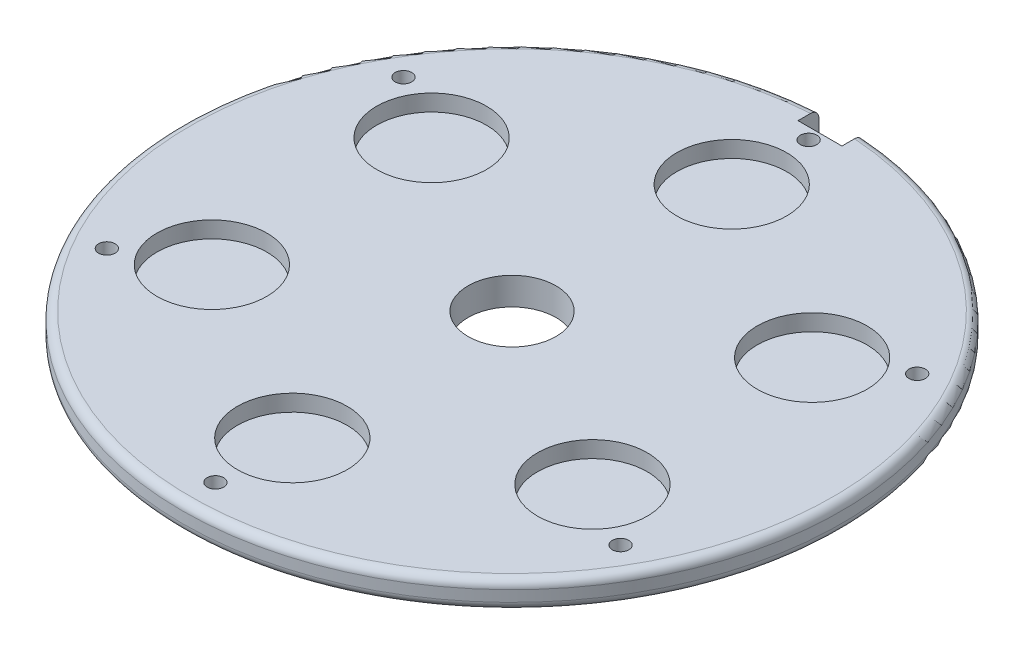
ISO-10303-21;
HEADER;
FILE_DESCRIPTION(('STEP AP214'),'2;1');
FILE_NAME('part.step','',(''),(''),'','','');
FILE_SCHEMA(('AUTOMOTIVE_DESIGN { 1 0 10303 214 1 1 1 1 }'));
ENDSEC;
DATA;
#1=APPLICATION_CONTEXT('core data for automotive mechanical design processes');
#2=APPLICATION_PROTOCOL_DEFINITION('international standard','automotive_design',2000,#1);
#3=PRODUCT_CONTEXT('',#1,'mechanical');
#4=PRODUCT('Part','Part','',(#3));
#5=PRODUCT_RELATED_PRODUCT_CATEGORY('part','',(#4));
#6=PRODUCT_DEFINITION_FORMATION('','',#4);
#7=PRODUCT_DEFINITION_CONTEXT('part definition',#1,'design');
#8=PRODUCT_DEFINITION('design','',#6,#7);
#9=PRODUCT_DEFINITION_SHAPE('','',#8);
#10=(LENGTH_UNIT() NAMED_UNIT(*) SI_UNIT(.MILLI.,.METRE.));
#11=(NAMED_UNIT(*) PLANE_ANGLE_UNIT() SI_UNIT($,.RADIAN.));
#12=(NAMED_UNIT(*) SI_UNIT($,.STERADIAN.) SOLID_ANGLE_UNIT());
#13=UNCERTAINTY_MEASURE_WITH_UNIT(LENGTH_MEASURE(1.E-05),#10,'distance_accuracy_value','');
#14=(GEOMETRIC_REPRESENTATION_CONTEXT(3) GLOBAL_UNCERTAINTY_ASSIGNED_CONTEXT((#13)) GLOBAL_UNIT_ASSIGNED_CONTEXT((#10,
#11,#12)) REPRESENTATION_CONTEXT('',''));
#15=CARTESIAN_POINT('',(0.,0.,0.));
#16=DIRECTION('',(0.,0.,1.));
#17=DIRECTION('',(1.,0.,0.));
#18=AXIS2_PLACEMENT_3D('',#15,#16,#17);
#19=CARTESIAN_POINT('',(0.,5.,0.));
#20=DIRECTION('',(0.,-1.,0.));
#21=DIRECTION('',(0.,0.,-1.));
#22=AXIS2_PLACEMENT_3D('',#19,#20,#21);
#23=CYLINDRICAL_SURFACE('',#22,59.9999999999999);
#24=DIRECTION('',(0.,-1.,0.));
#25=VECTOR('',#24,1.);
#26=CARTESIAN_POINT('',(-4.,5.,-59.866518188383));
#27=LINE('',#26,#25);
#28=CARTESIAN_POINT('',(-4.,3.5,-59.866518188383));
#29=VERTEX_POINT('',#28);
#30=CARTESIAN_POINT('',(-4.,1.5,-59.866518188383));
#31=VERTEX_POINT('',#30);
#32=EDGE_CURVE('E107',#29,#31,#27,.T.);
#33=ORIENTED_EDGE('',*,*,#32,.T.);
#34=CARTESIAN_POINT('',(0.,1.5,0.));
#35=DIRECTION('',(0.,1.,0.));
#36=DIRECTION('',(0.,0.,1.));
#37=AXIS2_PLACEMENT_3D('',#34,#35,#36);
#38=CIRCLE('',#37,59.9999999999999);
#39=CARTESIAN_POINT('',(4.,1.5,-59.866518188383));
#40=VERTEX_POINT('',#39);
#41=EDGE_CURVE('E211',#31,#40,#38,.T.);
#42=ORIENTED_EDGE('',*,*,#41,.T.);
#43=DIRECTION('',(0.,-1.,0.));
#44=VECTOR('',#43,1.);
#45=CARTESIAN_POINT('',(4.,5.,-59.866518188383));
#46=LINE('',#45,#44);
#47=CARTESIAN_POINT('',(4.,3.5,-59.866518188383));
#48=VERTEX_POINT('',#47);
#49=EDGE_CURVE('E127',#40,#48,#46,.F.);
#50=ORIENTED_EDGE('',*,*,#49,.T.);
#51=CARTESIAN_POINT('',(0.,3.5,0.));
#52=DIRECTION('',(0.,1.,0.));
#53=DIRECTION('',(0.,0.,1.));
#54=AXIS2_PLACEMENT_3D('',#51,#52,#53);
#55=CIRCLE('',#54,59.9999999999999);
#56=EDGE_CURVE('E209',#48,#29,#55,.F.);
#57=ORIENTED_EDGE('',*,*,#56,.T.);
#58=EDGE_LOOP('',(#33,#42,#50,#57));
#59=FACE_BOUND('',#58,.T.);
#60=ADVANCED_FACE('F39',(#59),#23,.T.);
#61=CARTESIAN_POINT('',(0.,5.,0.));
#62=DIRECTION('',(0.,1.,0.));
#63=DIRECTION('',(0.,0.,1.));
#64=AXIS2_PLACEMENT_3D('',#61,#62,#63);
#65=PLANE('',#64);
#66=DIRECTION('',(0.,0.,1.));
#67=VECTOR('',#66,1.);
#68=CARTESIAN_POINT('',(-4.,5.,-60.0670028712571));
#69=LINE('',#68,#67);
#70=CARTESIAN_POINT('',(-4.,5.,-58.3630876496437));
#71=VERTEX_POINT('',#70);
#72=CARTESIAN_POINT('',(-4.,5.,-56.0670028712571));
#73=VERTEX_POINT('',#72);
#74=EDGE_CURVE('E122',#71,#73,#69,.T.);
#75=ORIENTED_EDGE('',*,*,#74,.F.);
#76=CARTESIAN_POINT('',(0.,5.,0.));
#77=DIRECTION('',(0.,1.,0.));
#78=DIRECTION('',(0.,0.,1.));
#79=AXIS2_PLACEMENT_3D('',#76,#77,#78);
#80=CIRCLE('',#79,58.4999999999999);
#81=CARTESIAN_POINT('',(4.,5.,-58.3630876496437));
#82=VERTEX_POINT('',#81);
#83=EDGE_CURVE('E11',#71,#82,#80,.T.);
#84=ORIENTED_EDGE('',*,*,#83,.T.);
#85=DIRECTION('',(0.,0.,-1.));
#86=VECTOR('',#85,1.);
#87=CARTESIAN_POINT('',(4.,5.,-60.0670028712571));
#88=LINE('',#87,#86);
#89=CARTESIAN_POINT('',(4.,5.,-56.0670028712571));
#90=VERTEX_POINT('',#89);
#91=EDGE_CURVE('E120',#90,#82,#88,.T.);
#92=ORIENTED_EDGE('',*,*,#91,.F.);
#93=DIRECTION('',(1.,0.,0.));
#94=VECTOR('',#93,1.);
#95=CARTESIAN_POINT('',(-4.,5.,-56.0670028712571));
#96=LINE('',#95,#94);
#97=EDGE_CURVE('E103',#73,#90,#96,.T.);
#98=ORIENTED_EDGE('',*,*,#97,.F.);
#99=EDGE_LOOP('',(#75,#84,#92,#98));
#100=FACE_BOUND('',#99,.T.);
#101=CARTESIAN_POINT('',(46.7653718043594,5.,-27.0000000000005));
#102=DIRECTION('',(0.,1.,0.));
#103=DIRECTION('',(-0.866025403784433,0.,0.50000000000001));
#104=AXIS2_PLACEMENT_3D('',#101,#102,#103);
#105=CIRCLE('',#104,1.5);
#106=CARTESIAN_POINT('',(45.4663336986827,5.,-26.2500000000005));
#107=VERTEX_POINT('',#106);
#108=EDGE_CURVE('E130',#107,#107,#105,.T.);
#109=ORIENTED_EDGE('',*,*,#108,.F.);
#110=EDGE_LOOP('',(#109));
#111=FACE_BOUND('',#110,.T.);
#112=CARTESIAN_POINT('',(46.7653718043599,5.,26.9999999999996));
#113=DIRECTION('',(0.,1.,0.));
#114=DIRECTION('',(-0.866025403784443,0.,-0.499999999999992));
#115=AXIS2_PLACEMENT_3D('',#112,#113,#114);
#116=CIRCLE('',#115,1.5);
#117=CARTESIAN_POINT('',(45.4663336986833,5.,26.2499999999996));
#118=VERTEX_POINT('',#117);
#119=EDGE_CURVE('E147',#118,#118,#116,.T.);
#120=ORIENTED_EDGE('',*,*,#119,.F.);
#121=EDGE_LOOP('',(#120));
#122=FACE_BOUND('',#121,.T.);
#123=CARTESIAN_POINT('',(0.,5.,54.));
#124=DIRECTION('',(0.,1.,0.));
#125=DIRECTION('',(0.,0.,-1.));
#126=AXIS2_PLACEMENT_3D('',#123,#124,#125);
#127=CIRCLE('',#126,1.5);
#128=CARTESIAN_POINT('',(0.,5.,52.5));
#129=VERTEX_POINT('',#128);
#130=EDGE_CURVE('E141',#129,#129,#127,.T.);
#131=ORIENTED_EDGE('',*,*,#130,.F.);
#132=EDGE_LOOP('',(#131));
#133=FACE_BOUND('',#132,.T.);
#134=CARTESIAN_POINT('',(-46.7653718043596,5.,27.0000000000002));
#135=DIRECTION('',(0.,1.,0.));
#136=DIRECTION('',(0.866025403784436,0.,-0.500000000000004));
#137=AXIS2_PLACEMENT_3D('',#134,#135,#136);
#138=CIRCLE('',#137,1.5);
#139=CARTESIAN_POINT('',(-45.4663336986829,5.,26.2500000000002));
#140=VERTEX_POINT('',#139);
#141=EDGE_CURVE('E135',#140,#140,#138,.T.);
#142=ORIENTED_EDGE('',*,*,#141,.F.);
#143=EDGE_LOOP('',(#142));
#144=FACE_BOUND('',#143,.T.);
#145=CARTESIAN_POINT('',(-46.7653718043598,5.,-26.9999999999999));
#146=DIRECTION('',(0.,1.,0.));
#147=DIRECTION('',(0.86602540378444,0.,0.499999999999998));
#148=AXIS2_PLACEMENT_3D('',#145,#146,#147);
#149=CIRCLE('',#148,1.5);
#150=CARTESIAN_POINT('',(-45.4663336986831,5.,-26.2499999999999));
#151=VERTEX_POINT('',#150);
#152=EDGE_CURVE('E134',#151,#151,#149,.T.);
#153=ORIENTED_EDGE('',*,*,#152,.F.);
#154=EDGE_LOOP('',(#153));
#155=FACE_BOUND('',#154,.T.);
#156=CARTESIAN_POINT('',(0.,5.,-54.));
#157=DIRECTION('',(0.,1.,0.));
#158=DIRECTION('',(0.,0.,1.));
#159=AXIS2_PLACEMENT_3D('',#156,#157,#158);
#160=CIRCLE('',#159,1.5);
#161=CARTESIAN_POINT('',(0.,5.,-52.5));
#162=VERTEX_POINT('',#161);
#163=EDGE_CURVE('E158',#162,#162,#160,.T.);
#164=ORIENTED_EDGE('',*,*,#163,.F.);
#165=EDGE_LOOP('',(#164));
#166=FACE_BOUND('',#165,.T.);
#167=CARTESIAN_POINT('',(-34.6410161513773,5.,-20.0000000000004));
#168=DIRECTION('',(0.,1.,0.));
#169=DIRECTION('',(0.866025403784433,0.,0.50000000000001));
#170=AXIS2_PLACEMENT_3D('',#167,#168,#169);
#171=CIRCLE('',#170,10.);
#172=CARTESIAN_POINT('',(-25.980762113533,5.,-15.0000000000003));
#173=VERTEX_POINT('',#172);
#174=EDGE_CURVE('E164',#173,#173,#171,.T.);
#175=ORIENTED_EDGE('',*,*,#174,.F.);
#176=EDGE_LOOP('',(#175));
#177=FACE_BOUND('',#176,.T.);
#178=CARTESIAN_POINT('',(-34.6410161513777,5.,19.9999999999997));
#179=DIRECTION('',(0.,1.,0.));
#180=DIRECTION('',(0.866025403784443,0.,-0.499999999999992));
#181=AXIS2_PLACEMENT_3D('',#178,#179,#180);
#182=CIRCLE('',#181,10.);
#183=CARTESIAN_POINT('',(-25.9807621135333,5.,14.9999999999998));
#184=VERTEX_POINT('',#183);
#185=EDGE_CURVE('E183',#184,#184,#182,.T.);
#186=ORIENTED_EDGE('',*,*,#185,.F.);
#187=EDGE_LOOP('',(#186));
#188=FACE_BOUND('',#187,.T.);
#189=CARTESIAN_POINT('',(0.,5.,40.));
#190=DIRECTION('',(0.,1.,0.));
#191=DIRECTION('',(0.,0.,-1.));
#192=AXIS2_PLACEMENT_3D('',#189,#190,#191);
#193=CIRCLE('',#192,10.);
#194=CARTESIAN_POINT('',(0.,5.,30.));
#195=VERTEX_POINT('',#194);
#196=EDGE_CURVE('E177',#195,#195,#193,.T.);
#197=ORIENTED_EDGE('',*,*,#196,.F.);
#198=EDGE_LOOP('',(#197));
#199=FACE_BOUND('',#198,.T.);
#200=CARTESIAN_POINT('',(34.6410161513775,5.,20.0000000000002));
#201=DIRECTION('',(0.,1.,0.));
#202=DIRECTION('',(-0.866025403784436,0.,-0.500000000000004));
#203=AXIS2_PLACEMENT_3D('',#200,#201,#202);
#204=CIRCLE('',#203,10.);
#205=CARTESIAN_POINT('',(25.9807621135331,5.,15.0000000000001));
#206=VERTEX_POINT('',#205);
#207=EDGE_CURVE('E171',#206,#206,#204,.T.);
#208=ORIENTED_EDGE('',*,*,#207,.F.);
#209=EDGE_LOOP('',(#208));
#210=FACE_BOUND('',#209,.T.);
#211=CARTESIAN_POINT('',(34.6410161513776,5.,-19.9999999999999));
#212=DIRECTION('',(0.,1.,0.));
#213=DIRECTION('',(-0.86602540378444,0.,0.499999999999998));
#214=AXIS2_PLACEMENT_3D('',#211,#212,#213);
#215=CIRCLE('',#214,10.);
#216=CARTESIAN_POINT('',(25.9807621135332,5.,-14.9999999999999));
#217=VERTEX_POINT('',#216);
#218=EDGE_CURVE('E170',#217,#217,#215,.T.);
#219=ORIENTED_EDGE('',*,*,#218,.F.);
#220=EDGE_LOOP('',(#219));
#221=FACE_BOUND('',#220,.T.);
#222=CARTESIAN_POINT('',(0.,5.,-40.));
#223=DIRECTION('',(0.,1.,0.));
#224=DIRECTION('',(0.,0.,1.));
#225=AXIS2_PLACEMENT_3D('',#222,#223,#224);
#226=CIRCLE('',#225,10.);
#227=CARTESIAN_POINT('',(0.,5.,-30.));
#228=VERTEX_POINT('',#227);
#229=EDGE_CURVE('E194',#228,#228,#226,.T.);
#230=ORIENTED_EDGE('',*,*,#229,.F.);
#231=EDGE_LOOP('',(#230));
#232=FACE_BOUND('',#231,.T.);
#233=CARTESIAN_POINT('',(0.,5.,0.));
#234=DIRECTION('',(0.,1.,0.));
#235=DIRECTION('',(0.,0.,1.));
#236=AXIS2_PLACEMENT_3D('',#233,#234,#235);
#237=CIRCLE('',#236,8.);
#238=CARTESIAN_POINT('',(0.,5.,8.));
#239=VERTEX_POINT('',#238);
#240=EDGE_CURVE('E200',#239,#239,#237,.T.);
#241=ORIENTED_EDGE('',*,*,#240,.F.);
#242=EDGE_LOOP('',(#241));
#243=FACE_BOUND('',#242,.T.);
#244=ADVANCED_FACE('F310',(#100,#111,#122,#133,#144,#155,#166,#177,#188,#199,#210,#221,#232,
#243),#65,.T.);
#245=CARTESIAN_POINT('',(0.,0.,0.));
#246=DIRECTION('',(0.,1.,0.));
#247=DIRECTION('',(0.,0.,1.));
#248=AXIS2_PLACEMENT_3D('',#245,#246,#247);
#249=PLANE('',#248);
#250=CARTESIAN_POINT('',(46.7653718043594,0.,-27.0000000000005));
#251=DIRECTION('',(0.,1.,0.));
#252=DIRECTION('',(-0.866025403784433,0.,0.50000000000001));
#253=AXIS2_PLACEMENT_3D('',#250,#251,#252);
#254=CIRCLE('',#253,1.5);
#255=CARTESIAN_POINT('',(45.4663336986827,0.,-26.2500000000005));
#256=VERTEX_POINT('',#255);
#257=EDGE_CURVE('E150',#256,#256,#254,.T.);
#258=ORIENTED_EDGE('',*,*,#257,.T.);
#259=EDGE_LOOP('',(#258));
#260=FACE_BOUND('',#259,.T.);
#261=CARTESIAN_POINT('',(46.7653718043599,0.,26.9999999999996));
#262=DIRECTION('',(0.,1.,0.));
#263=DIRECTION('',(-0.866025403784443,0.,-0.499999999999992));
#264=AXIS2_PLACEMENT_3D('',#261,#262,#263);
#265=CIRCLE('',#264,1.5);
#266=CARTESIAN_POINT('',(45.4663336986833,0.,26.2499999999996));
#267=VERTEX_POINT('',#266);
#268=EDGE_CURVE('E144',#267,#267,#265,.T.);
#269=ORIENTED_EDGE('',*,*,#268,.T.);
#270=EDGE_LOOP('',(#269));
#271=FACE_BOUND('',#270,.T.);
#272=CARTESIAN_POINT('',(0.,0.,54.));
#273=DIRECTION('',(0.,1.,0.));
#274=DIRECTION('',(0.,0.,-1.));
#275=AXIS2_PLACEMENT_3D('',#272,#273,#274);
#276=CIRCLE('',#275,1.5);
#277=CARTESIAN_POINT('',(0.,0.,52.5));
#278=VERTEX_POINT('',#277);
#279=EDGE_CURVE('E138',#278,#278,#276,.T.);
#280=ORIENTED_EDGE('',*,*,#279,.T.);
#281=EDGE_LOOP('',(#280));
#282=FACE_BOUND('',#281,.T.);
#283=CARTESIAN_POINT('',(-46.7653718043596,0.,27.0000000000002));
#284=DIRECTION('',(0.,1.,0.));
#285=DIRECTION('',(0.866025403784436,0.,-0.500000000000004));
#286=AXIS2_PLACEMENT_3D('',#283,#284,#285);
#287=CIRCLE('',#286,1.5);
#288=CARTESIAN_POINT('',(-45.4663336986829,0.,26.2500000000002));
#289=VERTEX_POINT('',#288);
#290=EDGE_CURVE('E131',#289,#289,#287,.T.);
#291=ORIENTED_EDGE('',*,*,#290,.T.);
#292=EDGE_LOOP('',(#291));
#293=FACE_BOUND('',#292,.T.);
#294=CARTESIAN_POINT('',(-46.7653718043598,0.,-26.9999999999999));
#295=DIRECTION('',(0.,1.,0.));
#296=DIRECTION('',(0.86602540378444,0.,0.499999999999998));
#297=AXIS2_PLACEMENT_3D('',#294,#295,#296);
#298=CIRCLE('',#297,1.5);
#299=CARTESIAN_POINT('',(-45.4663336986831,0.,-26.2499999999999));
#300=VERTEX_POINT('',#299);
#301=EDGE_CURVE('E155',#300,#300,#298,.T.);
#302=ORIENTED_EDGE('',*,*,#301,.T.);
#303=EDGE_LOOP('',(#302));
#304=FACE_BOUND('',#303,.T.);
#305=CARTESIAN_POINT('',(0.,0.,-54.));
#306=DIRECTION('',(0.,1.,0.));
#307=DIRECTION('',(0.,0.,1.));
#308=AXIS2_PLACEMENT_3D('',#305,#306,#307);
#309=CIRCLE('',#308,1.5);
#310=CARTESIAN_POINT('',(0.,0.,-52.5));
#311=VERTEX_POINT('',#310);
#312=EDGE_CURVE('E161',#311,#311,#309,.T.);
#313=ORIENTED_EDGE('',*,*,#312,.T.);
#314=EDGE_LOOP('',(#313));
#315=FACE_BOUND('',#314,.T.);
#316=CARTESIAN_POINT('',(0.,0.,0.));
#317=DIRECTION('',(0.,1.,0.));
#318=DIRECTION('',(0.,0.,1.));
#319=AXIS2_PLACEMENT_3D('',#316,#317,#318);
#320=CIRCLE('',#319,8.);
#321=CARTESIAN_POINT('',(0.,0.,8.));
#322=VERTEX_POINT('',#321);
#323=EDGE_CURVE('E203',#322,#322,#320,.T.);
#324=ORIENTED_EDGE('',*,*,#323,.T.);
#325=EDGE_LOOP('',(#324));
#326=FACE_BOUND('',#325,.T.);
#327=DIRECTION('',(0.,0.,-1.));
#328=VECTOR('',#327,1.);
#329=CARTESIAN_POINT('',(4.,0.,-60.0670028712571));
#330=LINE('',#329,#328);
#331=CARTESIAN_POINT('',(4.,0.,-56.0670028712571));
#332=VERTEX_POINT('',#331);
#333=CARTESIAN_POINT('',(4.,0.,-58.3630876496437));
#334=VERTEX_POINT('',#333);
#335=EDGE_CURVE('E110',#332,#334,#330,.T.);
#336=ORIENTED_EDGE('',*,*,#335,.T.);
#337=CARTESIAN_POINT('',(0.,0.,0.));
#338=DIRECTION('',(0.,1.,0.));
#339=DIRECTION('',(0.,0.,1.));
#340=AXIS2_PLACEMENT_3D('',#337,#338,#339);
#341=CIRCLE('',#340,58.4999999999999);
#342=CARTESIAN_POINT('',(-4.,0.,-58.3630876496437));
#343=VERTEX_POINT('',#342);
#344=EDGE_CURVE('E63',#334,#343,#341,.F.);
#345=ORIENTED_EDGE('',*,*,#344,.T.);
#346=DIRECTION('',(0.,0.,1.));
#347=VECTOR('',#346,1.);
#348=CARTESIAN_POINT('',(-4.,0.,0.));
#349=LINE('',#348,#347);
#350=CARTESIAN_POINT('',(-4.,0.,-56.0670028712571));
#351=VERTEX_POINT('',#350);
#352=EDGE_CURVE('E116',#343,#351,#349,.T.);
#353=ORIENTED_EDGE('',*,*,#352,.T.);
#354=DIRECTION('',(1.,0.,0.));
#355=VECTOR('',#354,1.);
#356=CARTESIAN_POINT('',(-4.,0.,-56.0670028712571));
#357=LINE('',#356,#355);
#358=EDGE_CURVE('E100',#351,#332,#357,.T.);
#359=ORIENTED_EDGE('',*,*,#358,.T.);
#360=EDGE_LOOP('',(#336,#345,#353,#359));
#361=FACE_BOUND('',#360,.T.);
#362=ADVANCED_FACE('F115',(#260,#271,#282,#293,#304,#315,#326,#361),#249,.F.);
#363=CARTESIAN_POINT('',(0.,0.,0.));
#364=DIRECTION('',(0.,1.,0.));
#365=DIRECTION('',(0.,0.,1.));
#366=AXIS2_PLACEMENT_3D('',#363,#364,#365);
#367=CYLINDRICAL_SURFACE('',#366,8.);
#368=ORIENTED_EDGE('',*,*,#323,.F.);
#369=EDGE_LOOP('',(#368));
#370=FACE_BOUND('',#369,.T.);
#371=ORIENTED_EDGE('',*,*,#240,.T.);
#372=EDGE_LOOP('',(#371));
#373=FACE_BOUND('',#372,.T.);
#374=ADVANCED_FACE('F305',(#370,#373),#367,.F.);
#375=CARTESIAN_POINT('',(0.,2.,-40.));
#376=DIRECTION('',(0.,1.,0.));
#377=DIRECTION('',(0.,0.,1.));
#378=AXIS2_PLACEMENT_3D('',#375,#376,#377);
#379=CYLINDRICAL_SURFACE('',#378,10.);
#380=CARTESIAN_POINT('',(0.,2.,-40.));
#381=DIRECTION('',(0.,1.,0.));
#382=DIRECTION('',(0.,0.,1.));
#383=AXIS2_PLACEMENT_3D('',#380,#381,#382);
#384=CIRCLE('',#383,10.);
#385=CARTESIAN_POINT('',(0.,2.,-30.));
#386=VERTEX_POINT('',#385);
#387=EDGE_CURVE('E197',#386,#386,#384,.T.);
#388=ORIENTED_EDGE('',*,*,#387,.F.);
#389=EDGE_LOOP('',(#388));
#390=FACE_BOUND('',#389,.T.);
#391=ORIENTED_EDGE('',*,*,#229,.T.);
#392=EDGE_LOOP('',(#391));
#393=FACE_BOUND('',#392,.T.);
#394=ADVANCED_FACE('F301',(#390,#393),#379,.F.);
#395=CARTESIAN_POINT('',(0.,2.,-40.));
#396=DIRECTION('',(0.,1.,0.));
#397=DIRECTION('',(0.,0.,1.));
#398=AXIS2_PLACEMENT_3D('',#395,#396,#397);
#399=PLANE('',#398);
#400=ORIENTED_EDGE('',*,*,#387,.T.);
#401=EDGE_LOOP('',(#400));
#402=FACE_BOUND('',#401,.T.);
#403=ADVANCED_FACE('F297',(#402),#399,.T.);
#404=CARTESIAN_POINT('',(34.6410161513776,2.,-19.9999999999999));
#405=DIRECTION('',(0.,1.,0.));
#406=DIRECTION('',(0.,0.,1.));
#407=AXIS2_PLACEMENT_3D('',#404,#405,#406);
#408=CYLINDRICAL_SURFACE('',#407,10.);
#409=CARTESIAN_POINT('',(34.6410161513776,2.,-19.9999999999999));
#410=DIRECTION('',(0.,1.,0.));
#411=DIRECTION('',(-0.86602540378444,0.,0.499999999999998));
#412=AXIS2_PLACEMENT_3D('',#409,#410,#411);
#413=CIRCLE('',#412,10.);
#414=CARTESIAN_POINT('',(25.9807621135332,2.,-14.9999999999999));
#415=VERTEX_POINT('',#414);
#416=EDGE_CURVE('E191',#415,#415,#413,.T.);
#417=ORIENTED_EDGE('',*,*,#416,.F.);
#418=EDGE_LOOP('',(#417));
#419=FACE_BOUND('',#418,.T.);
#420=ORIENTED_EDGE('',*,*,#218,.T.);
#421=EDGE_LOOP('',(#420));
#422=FACE_BOUND('',#421,.T.);
#423=ADVANCED_FACE('F293',(#419,#422),#408,.F.);
#424=CARTESIAN_POINT('',(34.6410161513776,2.,-19.9999999999999));
#425=DIRECTION('',(0.,1.,0.));
#426=DIRECTION('',(-0.86602540378444,0.,0.499999999999998));
#427=AXIS2_PLACEMENT_3D('',#424,#425,#426);
#428=PLANE('',#427);
#429=ORIENTED_EDGE('',*,*,#416,.T.);
#430=EDGE_LOOP('',(#429));
#431=FACE_BOUND('',#430,.T.);
#432=ADVANCED_FACE('F267',(#431),#428,.T.);
#433=CARTESIAN_POINT('',(34.6410161513775,2.,20.0000000000002));
#434=DIRECTION('',(0.,1.,0.));
#435=DIRECTION('',(0.,0.,1.));
#436=AXIS2_PLACEMENT_3D('',#433,#434,#435);
#437=CYLINDRICAL_SURFACE('',#436,10.);
#438=CARTESIAN_POINT('',(34.6410161513775,2.,20.0000000000002));
#439=DIRECTION('',(0.,1.,0.));
#440=DIRECTION('',(-0.866025403784436,0.,-0.500000000000004));
#441=AXIS2_PLACEMENT_3D('',#438,#439,#440);
#442=CIRCLE('',#441,10.);
#443=CARTESIAN_POINT('',(25.9807621135331,2.,15.0000000000001));
#444=VERTEX_POINT('',#443);
#445=EDGE_CURVE('E167',#444,#444,#442,.T.);
#446=ORIENTED_EDGE('',*,*,#445,.F.);
#447=EDGE_LOOP('',(#446));
#448=FACE_BOUND('',#447,.T.);
#449=ORIENTED_EDGE('',*,*,#207,.T.);
#450=EDGE_LOOP('',(#449));
#451=FACE_BOUND('',#450,.T.);
#452=ADVANCED_FACE('F263',(#448,#451),#437,.F.);
#453=CARTESIAN_POINT('',(34.6410161513775,2.,20.0000000000002));
#454=DIRECTION('',(0.,1.,0.));
#455=DIRECTION('',(-0.866025403784436,0.,-0.500000000000004));
#456=AXIS2_PLACEMENT_3D('',#453,#454,#455);
#457=PLANE('',#456);
#458=ORIENTED_EDGE('',*,*,#445,.T.);
#459=EDGE_LOOP('',(#458));
#460=FACE_BOUND('',#459,.T.);
#461=ADVANCED_FACE('F259',(#460),#457,.T.);
#462=CARTESIAN_POINT('',(0.,2.,40.));
#463=DIRECTION('',(0.,1.,0.));
#464=DIRECTION('',(0.,0.,1.));
#465=AXIS2_PLACEMENT_3D('',#462,#463,#464);
#466=CYLINDRICAL_SURFACE('',#465,10.);
#467=CARTESIAN_POINT('',(0.,2.,40.));
#468=DIRECTION('',(0.,1.,0.));
#469=DIRECTION('',(0.,0.,-1.));
#470=AXIS2_PLACEMENT_3D('',#467,#468,#469);
#471=CIRCLE('',#470,10.);
#472=CARTESIAN_POINT('',(0.,2.,30.));
#473=VERTEX_POINT('',#472);
#474=EDGE_CURVE('E174',#473,#473,#471,.T.);
#475=ORIENTED_EDGE('',*,*,#474,.F.);
#476=EDGE_LOOP('',(#475));
#477=FACE_BOUND('',#476,.T.);
#478=ORIENTED_EDGE('',*,*,#196,.T.);
#479=EDGE_LOOP('',(#478));
#480=FACE_BOUND('',#479,.T.);
#481=ADVANCED_FACE('F262',(#477,#480),#466,.F.);
#482=CARTESIAN_POINT('',(0.,2.,40.));
#483=DIRECTION('',(0.,1.,0.));
#484=DIRECTION('',(0.,0.,-1.));
#485=AXIS2_PLACEMENT_3D('',#482,#483,#484);
#486=PLANE('',#485);
#487=ORIENTED_EDGE('',*,*,#474,.T.);
#488=EDGE_LOOP('',(#487));
#489=FACE_BOUND('',#488,.T.);
#490=ADVANCED_FACE('F269',(#489),#486,.T.);
#491=CARTESIAN_POINT('',(-34.6410161513777,2.,19.9999999999997));
#492=DIRECTION('',(0.,1.,0.));
#493=DIRECTION('',(0.,0.,1.));
#494=AXIS2_PLACEMENT_3D('',#491,#492,#493);
#495=CYLINDRICAL_SURFACE('',#494,10.);
#496=CARTESIAN_POINT('',(-34.6410161513777,2.,19.9999999999997));
#497=DIRECTION('',(0.,1.,0.));
#498=DIRECTION('',(0.866025403784443,0.,-0.499999999999992));
#499=AXIS2_PLACEMENT_3D('',#496,#497,#498);
#500=CIRCLE('',#499,10.);
#501=CARTESIAN_POINT('',(-25.9807621135333,2.,14.9999999999998));
#502=VERTEX_POINT('',#501);
#503=EDGE_CURVE('E180',#502,#502,#500,.T.);
#504=ORIENTED_EDGE('',*,*,#503,.F.);
#505=EDGE_LOOP('',(#504));
#506=FACE_BOUND('',#505,.T.);
#507=ORIENTED_EDGE('',*,*,#185,.T.);
#508=EDGE_LOOP('',(#507));
#509=FACE_BOUND('',#508,.T.);
#510=ADVANCED_FACE('F272',(#506,#509),#495,.F.);
#511=CARTESIAN_POINT('',(-34.6410161513777,2.,19.9999999999997));
#512=DIRECTION('',(0.,1.,0.));
#513=DIRECTION('',(0.866025403784443,0.,-0.499999999999992));
#514=AXIS2_PLACEMENT_3D('',#511,#512,#513);
#515=PLANE('',#514);
#516=ORIENTED_EDGE('',*,*,#503,.T.);
#517=EDGE_LOOP('',(#516));
#518=FACE_BOUND('',#517,.T.);
#519=ADVANCED_FACE('F277',(#518),#515,.T.);
#520=CARTESIAN_POINT('',(-34.6410161513773,2.,-20.0000000000004));
#521=DIRECTION('',(0.,1.,0.));
#522=DIRECTION('',(0.,0.,1.));
#523=AXIS2_PLACEMENT_3D('',#520,#521,#522);
#524=CYLINDRICAL_SURFACE('',#523,10.);
#525=CARTESIAN_POINT('',(-34.6410161513773,2.,-20.0000000000004));
#526=DIRECTION('',(0.,1.,0.));
#527=DIRECTION('',(0.866025403784433,0.,0.50000000000001));
#528=AXIS2_PLACEMENT_3D('',#525,#526,#527);
#529=CIRCLE('',#528,10.);
#530=CARTESIAN_POINT('',(-25.980762113533,2.,-15.0000000000003));
#531=VERTEX_POINT('',#530);
#532=EDGE_CURVE('E186',#531,#531,#529,.T.);
#533=ORIENTED_EDGE('',*,*,#532,.F.);
#534=EDGE_LOOP('',(#533));
#535=FACE_BOUND('',#534,.T.);
#536=ORIENTED_EDGE('',*,*,#174,.T.);
#537=EDGE_LOOP('',(#536));
#538=FACE_BOUND('',#537,.T.);
#539=ADVANCED_FACE('F280',(#535,#538),#524,.F.);
#540=CARTESIAN_POINT('',(-34.6410161513773,2.,-20.0000000000004));
#541=DIRECTION('',(0.,1.,0.));
#542=DIRECTION('',(0.866025403784433,0.,0.50000000000001));
#543=AXIS2_PLACEMENT_3D('',#540,#541,#542);
#544=PLANE('',#543);
#545=ORIENTED_EDGE('',*,*,#532,.T.);
#546=EDGE_LOOP('',(#545));
#547=FACE_BOUND('',#546,.T.);
#548=ADVANCED_FACE('F257',(#547),#544,.T.);
#549=CARTESIAN_POINT('',(0.,0.,-54.));
#550=DIRECTION('',(0.,1.,0.));
#551=DIRECTION('',(0.,0.,1.));
#552=AXIS2_PLACEMENT_3D('',#549,#550,#551);
#553=CYLINDRICAL_SURFACE('',#552,1.5);
#554=ORIENTED_EDGE('',*,*,#312,.F.);
#555=EDGE_LOOP('',(#554));
#556=FACE_BOUND('',#555,.T.);
#557=ORIENTED_EDGE('',*,*,#163,.T.);
#558=EDGE_LOOP('',(#557));
#559=FACE_BOUND('',#558,.T.);
#560=ADVANCED_FACE('F253',(#556,#559),#553,.F.);
#561=CARTESIAN_POINT('',(-46.7653718043598,0.,-26.9999999999999));
#562=DIRECTION('',(0.,1.,0.));
#563=DIRECTION('',(0.,0.,1.));
#564=AXIS2_PLACEMENT_3D('',#561,#562,#563);
#565=CYLINDRICAL_SURFACE('',#564,1.5);
#566=ORIENTED_EDGE('',*,*,#301,.F.);
#567=EDGE_LOOP('',(#566));
#568=FACE_BOUND('',#567,.T.);
#569=ORIENTED_EDGE('',*,*,#152,.T.);
#570=EDGE_LOOP('',(#569));
#571=FACE_BOUND('',#570,.T.);
#572=ADVANCED_FACE('F239',(#568,#571),#565,.F.);
#573=CARTESIAN_POINT('',(-46.7653718043596,0.,27.0000000000002));
#574=DIRECTION('',(0.,1.,0.));
#575=DIRECTION('',(0.,0.,1.));
#576=AXIS2_PLACEMENT_3D('',#573,#574,#575);
#577=CYLINDRICAL_SURFACE('',#576,1.5);
#578=ORIENTED_EDGE('',*,*,#290,.F.);
#579=EDGE_LOOP('',(#578));
#580=FACE_BOUND('',#579,.T.);
#581=ORIENTED_EDGE('',*,*,#141,.T.);
#582=EDGE_LOOP('',(#581));
#583=FACE_BOUND('',#582,.T.);
#584=ADVANCED_FACE('F234',(#580,#583),#577,.F.);
#585=CARTESIAN_POINT('',(0.,0.,54.));
#586=DIRECTION('',(0.,1.,0.));
#587=DIRECTION('',(0.,0.,1.));
#588=AXIS2_PLACEMENT_3D('',#585,#586,#587);
#589=CYLINDRICAL_SURFACE('',#588,1.5);
#590=ORIENTED_EDGE('',*,*,#279,.F.);
#591=EDGE_LOOP('',(#590));
#592=FACE_BOUND('',#591,.T.);
#593=ORIENTED_EDGE('',*,*,#130,.T.);
#594=EDGE_LOOP('',(#593));
#595=FACE_BOUND('',#594,.T.);
#596=ADVANCED_FACE('F238',(#592,#595),#589,.F.);
#597=CARTESIAN_POINT('',(46.7653718043599,0.,26.9999999999996));
#598=DIRECTION('',(0.,1.,0.));
#599=DIRECTION('',(0.,0.,1.));
#600=AXIS2_PLACEMENT_3D('',#597,#598,#599);
#601=CYLINDRICAL_SURFACE('',#600,1.5);
#602=ORIENTED_EDGE('',*,*,#268,.F.);
#603=EDGE_LOOP('',(#602));
#604=FACE_BOUND('',#603,.T.);
#605=ORIENTED_EDGE('',*,*,#119,.T.);
#606=EDGE_LOOP('',(#605));
#607=FACE_BOUND('',#606,.T.);
#608=ADVANCED_FACE('F243',(#604,#607),#601,.F.);
#609=CARTESIAN_POINT('',(46.7653718043594,0.,-27.0000000000005));
#610=DIRECTION('',(0.,1.,0.));
#611=DIRECTION('',(0.,0.,1.));
#612=AXIS2_PLACEMENT_3D('',#609,#610,#611);
#613=CYLINDRICAL_SURFACE('',#612,1.5);
#614=ORIENTED_EDGE('',*,*,#257,.F.);
#615=EDGE_LOOP('',(#614));
#616=FACE_BOUND('',#615,.T.);
#617=ORIENTED_EDGE('',*,*,#108,.T.);
#618=EDGE_LOOP('',(#617));
#619=FACE_BOUND('',#618,.T.);
#620=ADVANCED_FACE('F231',(#616,#619),#613,.F.);
#621=CARTESIAN_POINT('',(4.,0.,-60.0670028712571));
#622=DIRECTION('',(1.,0.,0.));
#623=DIRECTION('',(0.,0.,-1.));
#624=AXIS2_PLACEMENT_3D('',#621,#622,#623);
#625=PLANE('',#624);
#626=ORIENTED_EDGE('',*,*,#49,.F.);
#627=CARTESIAN_POINT('',(4.,1.5,-59.866518188383));
#628=CARTESIAN_POINT('',(4.,1.45786661955789,-59.8665179564857));
#629=CARTESIAN_POINT('',(4.,1.41575344739014,-59.8647378881121));
#630=CARTESIAN_POINT('',(4.,1.3318289720945,-59.8576368006111));
#631=CARTESIAN_POINT('',(4.,1.29001765329193,-59.8523159667056));
#632=CARTESIAN_POINT('',(4.,1.16556409035833,-59.8310943476596));
#633=CARTESIAN_POINT('',(4.,1.08375631445557,-59.8099342963139));
#634=CARTESIAN_POINT('',(4.,0.924858015965371,-59.7541837696975));
#635=CARTESIAN_POINT('',(4.,0.847769676349292,-59.7195871328742));
#636=CARTESIAN_POINT('',(4.,0.700488988113848,-59.6379583142417));
#637=CARTESIAN_POINT('',(4.,0.630295547560307,-59.5909281058864));
#638=CARTESIAN_POINT('',(4.,0.498720224803779,-59.4857237922965));
#639=CARTESIAN_POINT('',(4.,0.437346864167151,-59.4275390350067));
#640=CARTESIAN_POINT('',(4.,0.325201731835088,-59.3016975797179));
#641=CARTESIAN_POINT('',(4.,0.274432076060009,-59.2340389957513));
#642=CARTESIAN_POINT('',(4.,0.184829328177131,-59.0910230290413));
#643=CARTESIAN_POINT('',(4.,0.14602399510312,-59.0156482749005));
#644=CARTESIAN_POINT('',(4.,0.0816077441513852,-58.8594770396817));
#645=CARTESIAN_POINT('',(4.,0.0559895382579425,-58.77868358128));
#646=CARTESIAN_POINT('',(4.,0.0249152173786658,-58.641693828821));
#647=CARTESIAN_POINT('',(4.,0.0155775927916901,-58.5863465093743));
#648=CARTESIAN_POINT('',(4.,0.0031207137025294,-58.4750362535704));
#649=CARTESIAN_POINT('',(4.,-7.35443101487886E-06,-58.4190743032879));
#650=CARTESIAN_POINT('',(4.,0.,-58.3630876496437));
#651=B_SPLINE_CURVE_WITH_KNOTS('',3,(#627,#628,#629,#630,#631,#632,#633,#634,#635,#636,#637,
#638,#639,#640,#641,#642,#643,#644,#645,#646,#647,#648,#649,#650),.UNSPECIFIED.,.F.,.F.,(4,2,2,
2,2,2,2,2,2,2,2,4),(0.,0.126322423399215,0.252638239237139,0.504837672810456,0.757152893117169,
1.00942809002147,1.26194540851543,1.51451306763428,1.76766238706513,2.02067165003228,
2.18873490851917,2.35655945273621),.UNSPECIFIED.);
#652=EDGE_CURVE('E113',#40,#334,#651,.T.);
#653=ORIENTED_EDGE('',*,*,#652,.T.);
#654=ORIENTED_EDGE('',*,*,#335,.F.);
#655=DIRECTION('',(0.,1.,0.));
#656=VECTOR('',#655,1.);
#657=CARTESIAN_POINT('',(4.,0.,-56.0670028712571));
#658=LINE('',#657,#656);
#659=EDGE_CURVE('E95',#332,#90,#658,.T.);
#660=ORIENTED_EDGE('',*,*,#659,.T.);
#661=ORIENTED_EDGE('',*,*,#91,.T.);
#662=CARTESIAN_POINT('',(4.,5.,-58.3630876496437));
#663=CARTESIAN_POINT('',(4.,4.9999996657765,-58.4054578155254));
#664=CARTESIAN_POINT('',(4.,4.99821204513819,-58.4478077159664));
#665=CARTESIAN_POINT('',(4.,4.99108003229486,-58.5322050706051));
#666=CARTESIAN_POINT('',(4.,4.98573579233989,-58.5742525376713));
#667=CARTESIAN_POINT('',(4.,4.96441711273444,-58.6994217972384));
#668=CARTESIAN_POINT('',(4.,4.94315658247137,-58.7817060991201));
#669=CARTESIAN_POINT('',(4.,4.88711999313408,-58.9415365190345));
#670=CARTESIAN_POINT('',(4.,4.85233710449036,-59.019080219852));
#671=CARTESIAN_POINT('',(4.,4.77023678001652,-59.1672153244249));
#672=CARTESIAN_POINT('',(4.,4.72292180265415,-59.2378080880502));
#673=CARTESIAN_POINT('',(4.,4.61714865398228,-59.369951938571));
#674=CARTESIAN_POINT('',(4.,4.55870274838223,-59.4315128471335));
#675=CARTESIAN_POINT('',(4.,4.43227098701434,-59.5439360705235));
#676=CARTESIAN_POINT('',(4.,4.36428330640549,-59.594796334218));
#677=CARTESIAN_POINT('',(4.,4.22086123209301,-59.6842473786621));
#678=CARTESIAN_POINT('',(4.,4.14544178225657,-59.7228621485365));
#679=CARTESIAN_POINT('',(4.,3.98919718008172,-59.7868322524394));
#680=CARTESIAN_POINT('',(4.,3.90837540139823,-59.8121957759651));
#681=CARTESIAN_POINT('',(4.,3.77253386528954,-59.8425195707193));
#682=CARTESIAN_POINT('',(4.,3.71838050813676,-59.8515136417471));
#683=CARTESIAN_POINT('',(4.,3.60949246802717,-59.8635120548441));
#684=CARTESIAN_POINT('',(4.,3.55475872208416,-59.8665249031433));
#685=CARTESIAN_POINT('',(4.,3.5,-59.866518188383));
#686=B_SPLINE_CURVE_WITH_KNOTS('',3,(#662,#663,#664,#665,#666,#667,#668,#669,#670,#671,#672,
#673,#674,#675,#676,#677,#678,#679,#680,#681,#682,#683,#684,#685),.UNSPECIFIED.,.F.,.F.,(4,2,2,
2,2,2,2,2,2,2,2,4),(0.,0.127032525228679,0.254059612860072,0.507712008890123,0.761492680763758,
1.01522360433881,1.26867653056526,1.5221779952615,1.77517973383681,2.02802492749204,
2.19240356409963,2.35654826074284),.UNSPECIFIED.);
#687=EDGE_CURVE('E214',#82,#48,#686,.T.);
#688=ORIENTED_EDGE('',*,*,#687,.T.);
#689=EDGE_LOOP('',(#626,#653,#654,#660,#661,#688));
#690=FACE_BOUND('',#689,.T.);
#691=ADVANCED_FACE('F112',(#690),#625,.F.);
#692=CARTESIAN_POINT('',(-4.,0.,-60.0670028712571));
#693=DIRECTION('',(-1.,0.,0.));
#694=DIRECTION('',(0.,0.,1.));
#695=AXIS2_PLACEMENT_3D('',#692,#693,#694);
#696=PLANE('',#695);
#697=ORIENTED_EDGE('',*,*,#352,.F.);
#698=CARTESIAN_POINT('',(-4.,0.,-58.3630876496437));
#699=CARTESIAN_POINT('',(-4.,3.34223502808556E-07,-58.4054578155254));
#700=CARTESIAN_POINT('',(-4.,0.00178795486181128,-58.4478077159664));
#701=CARTESIAN_POINT('',(-4.,0.00891996770513542,-58.5322050706051));
#702=CARTESIAN_POINT('',(-4.,0.0142642076601076,-58.5742525376713));
#703=CARTESIAN_POINT('',(-4.,0.0355828872655572,-58.6994217972384));
#704=CARTESIAN_POINT('',(-4.,0.0568434175286343,-58.7817060991201));
#705=CARTESIAN_POINT('',(-4.,0.112880006865924,-58.9415365190345));
#706=CARTESIAN_POINT('',(-4.,0.147662895509636,-59.019080219852));
#707=CARTESIAN_POINT('',(-4.,0.229763219983484,-59.1672153244249));
#708=CARTESIAN_POINT('',(-4.,0.277078197345852,-59.2378080880502));
#709=CARTESIAN_POINT('',(-4.,0.382851346017716,-59.369951938571));
#710=CARTESIAN_POINT('',(-4.,0.441297251617772,-59.4315128471335));
#711=CARTESIAN_POINT('',(-4.,0.567729012985658,-59.5439360705235));
#712=CARTESIAN_POINT('',(-4.,0.635716693594507,-59.594796334218));
#713=CARTESIAN_POINT('',(-4.,0.779138767906992,-59.6842473786621));
#714=CARTESIAN_POINT('',(-4.,0.854558217743429,-59.7228621485365));
#715=CARTESIAN_POINT('',(-4.,1.01080281991828,-59.7868322524394));
#716=CARTESIAN_POINT('',(-4.,1.09162459860177,-59.8121957759651));
#717=CARTESIAN_POINT('',(-4.,1.22746613471046,-59.8425195707193));
#718=CARTESIAN_POINT('',(-4.,1.28161949186324,-59.8515136417471));
#719=CARTESIAN_POINT('',(-4.,1.39050753197283,-59.8635120548441));
#720=CARTESIAN_POINT('',(-4.,1.44524127791584,-59.8665249031433));
#721=CARTESIAN_POINT('',(-4.,1.5,-59.866518188383));
#722=B_SPLINE_CURVE_WITH_KNOTS('',3,(#698,#699,#700,#701,#702,#703,#704,#705,#706,#707,#708,
#709,#710,#711,#712,#713,#714,#715,#716,#717,#718,#719,#720,#721),.UNSPECIFIED.,.F.,.F.,(4,2,2,
2,2,2,2,2,2,2,2,4),(0.,0.127032525228679,0.254059612860071,0.507712008890123,0.761492680763758,
1.01522360433881,1.26867653056526,1.5221779952615,1.77517973383681,2.02802492749204,
2.19240356409963,2.35654826074284),.UNSPECIFIED.);
#723=EDGE_CURVE('E48',#343,#31,#722,.T.);
#724=ORIENTED_EDGE('',*,*,#723,.T.);
#725=ORIENTED_EDGE('',*,*,#32,.F.);
#726=CARTESIAN_POINT('',(-4.,3.5,-59.866518188383));
#727=CARTESIAN_POINT('',(-4.,3.54213338044211,-59.8665179564857));
#728=CARTESIAN_POINT('',(-4.,3.58424655260986,-59.8647378881121));
#729=CARTESIAN_POINT('',(-4.,3.6681710279055,-59.8576368006111));
#730=CARTESIAN_POINT('',(-4.,3.70998234670807,-59.8523159667056));
#731=CARTESIAN_POINT('',(-4.,3.83443590964167,-59.8310943476596));
#732=CARTESIAN_POINT('',(-4.,3.91624368554443,-59.8099342963139));
#733=CARTESIAN_POINT('',(-4.,4.07514198403463,-59.7541837696975));
#734=CARTESIAN_POINT('',(-4.,4.15223032365071,-59.7195871328742));
#735=CARTESIAN_POINT('',(-4.,4.29951101188615,-59.6379583142417));
#736=CARTESIAN_POINT('',(-4.,4.36970445243969,-59.5909281058864));
#737=CARTESIAN_POINT('',(-4.,4.50127977519622,-59.4857237922965));
#738=CARTESIAN_POINT('',(-4.,4.56265313583285,-59.4275390350067));
#739=CARTESIAN_POINT('',(-4.,4.67479826816491,-59.3016975797179));
#740=CARTESIAN_POINT('',(-4.,4.72556792393999,-59.2340389957513));
#741=CARTESIAN_POINT('',(-4.,4.81517067182287,-59.0910230290413));
#742=CARTESIAN_POINT('',(-4.,4.85397600489688,-59.0156482749005));
#743=CARTESIAN_POINT('',(-4.,4.91839225584861,-58.8594770396817));
#744=CARTESIAN_POINT('',(-4.,4.94401046174206,-58.77868358128));
#745=CARTESIAN_POINT('',(-4.,4.97508478262134,-58.641693828821));
#746=CARTESIAN_POINT('',(-4.,4.98442240720831,-58.5863465093743));
#747=CARTESIAN_POINT('',(-4.,4.99687928629747,-58.4750362535704));
#748=CARTESIAN_POINT('',(-4.,5.00000735443101,-58.4190743032879));
#749=CARTESIAN_POINT('',(-4.,5.,-58.3630876496437));
#750=B_SPLINE_CURVE_WITH_KNOTS('',3,(#726,#727,#728,#729,#730,#731,#732,#733,#734,#735,#736,
#737,#738,#739,#740,#741,#742,#743,#744,#745,#746,#747,#748,#749),.UNSPECIFIED.,.F.,.F.,(4,2,2,
2,2,2,2,2,2,2,2,4),(0.,0.126322423399215,0.252638239237139,0.504837672810456,0.757152893117169,
1.00942809002147,1.26194540851543,1.51451306763428,1.76766238706513,2.02067165003228,
2.18873490851917,2.35655945273621),.UNSPECIFIED.);
#751=EDGE_CURVE('E55',#29,#71,#750,.T.);
#752=ORIENTED_EDGE('',*,*,#751,.T.);
#753=ORIENTED_EDGE('',*,*,#74,.T.);
#754=DIRECTION('',(0.,1.,0.));
#755=VECTOR('',#754,1.);
#756=CARTESIAN_POINT('',(-4.,0.,-56.0670028712571));
#757=LINE('',#756,#755);
#758=EDGE_CURVE('E108',#351,#73,#757,.T.);
#759=ORIENTED_EDGE('',*,*,#758,.F.);
#760=EDGE_LOOP('',(#697,#724,#725,#752,#753,#759));
#761=FACE_BOUND('',#760,.T.);
#762=ADVANCED_FACE('F230',(#761),#696,.F.);
#763=CARTESIAN_POINT('',(-4.,0.,-56.0670028712571));
#764=DIRECTION('',(0.,0.,1.));
#765=DIRECTION('',(1.,0.,0.));
#766=AXIS2_PLACEMENT_3D('',#763,#764,#765);
#767=PLANE('',#766);
#768=ORIENTED_EDGE('',*,*,#97,.T.);
#769=ORIENTED_EDGE('',*,*,#659,.F.);
#770=ORIENTED_EDGE('',*,*,#358,.F.);
#771=ORIENTED_EDGE('',*,*,#758,.T.);
#772=EDGE_LOOP('',(#768,#769,#770,#771));
#773=FACE_BOUND('',#772,.T.);
#774=ADVANCED_FACE('F97',(#773),#767,.F.);
#775=CARTESIAN_POINT('',(0.,1.5,0.));
#776=DIRECTION('',(0.,1.,0.));
#777=DIRECTION('',(0.,0.,1.));
#778=AXIS2_PLACEMENT_3D('',#775,#776,#777);
#779=TOROIDAL_SURFACE('',#778,58.4999999999999,1.5);
#780=ORIENTED_EDGE('',*,*,#723,.F.);
#781=ORIENTED_EDGE('',*,*,#344,.F.);
#782=ORIENTED_EDGE('',*,*,#652,.F.);
#783=ORIENTED_EDGE('',*,*,#41,.F.);
#784=EDGE_LOOP('',(#780,#781,#782,#783));
#785=FACE_BOUND('',#784,.T.);
#786=ADVANCED_FACE('F319',(#785),#779,.T.);
#787=CARTESIAN_POINT('',(0.,3.5,0.));
#788=DIRECTION('',(0.,1.,0.));
#789=DIRECTION('',(0.,0.,1.));
#790=AXIS2_PLACEMENT_3D('',#787,#788,#789);
#791=TOROIDAL_SURFACE('',#790,58.4999999999999,1.5);
#792=ORIENTED_EDGE('',*,*,#751,.F.);
#793=ORIENTED_EDGE('',*,*,#56,.F.);
#794=ORIENTED_EDGE('',*,*,#687,.F.);
#795=ORIENTED_EDGE('',*,*,#83,.F.);
#796=EDGE_LOOP('',(#792,#793,#794,#795));
#797=FACE_BOUND('',#796,.T.);
#798=ADVANCED_FACE('F41',(#797),#791,.T.);
#799=CLOSED_SHELL('',(#60,#244,#362,#374,#394,#403,#423,#432,#452,#461,#481,#490,#510,#519,#539,
#548,#560,#572,#584,#596,#608,#620,#691,#762,#774,#786,#798));
#800=MANIFOLD_SOLID_BREP('B2',#799);
#801=ADVANCED_BREP_SHAPE_REPRESENTATION('',(#18,#800),#14);
#802=SHAPE_DEFINITION_REPRESENTATION(#9,#801);
ENDSEC;
END-ISO-10303-21;
